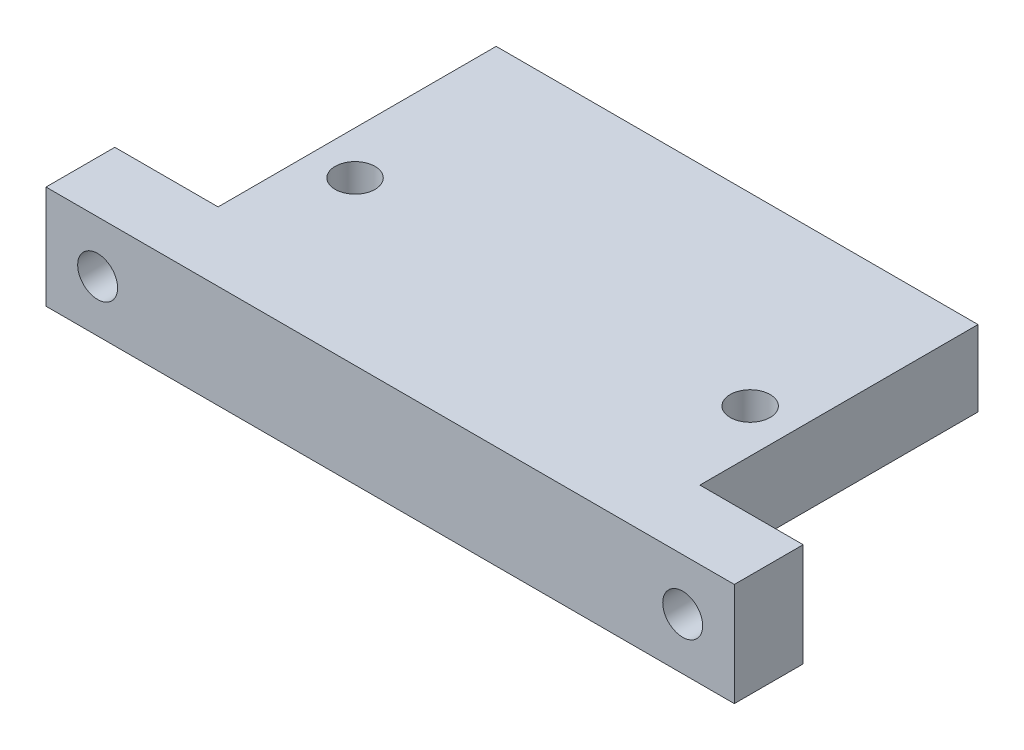
ISO-10303-21;
HEADER;
FILE_DESCRIPTION(('STEP AP214'),'2;1');
FILE_NAME('part.step','',(''),(''),'','','');
FILE_SCHEMA(('AUTOMOTIVE_DESIGN { 1 0 10303 214 1 1 1 1 }'));
ENDSEC;
DATA;
#1=APPLICATION_CONTEXT('core data for automotive mechanical design processes');
#2=APPLICATION_PROTOCOL_DEFINITION('international standard','automotive_design',2000,#1);
#3=PRODUCT_CONTEXT('',#1,'mechanical');
#4=PRODUCT('Part','Part','',(#3));
#5=PRODUCT_RELATED_PRODUCT_CATEGORY('part','',(#4));
#6=PRODUCT_DEFINITION_FORMATION('','',#4);
#7=PRODUCT_DEFINITION_CONTEXT('part definition',#1,'design');
#8=PRODUCT_DEFINITION('design','',#6,#7);
#9=PRODUCT_DEFINITION_SHAPE('','',#8);
#10=(LENGTH_UNIT() NAMED_UNIT(*) SI_UNIT(.MILLI.,.METRE.));
#11=(NAMED_UNIT(*) PLANE_ANGLE_UNIT() SI_UNIT($,.RADIAN.));
#12=(NAMED_UNIT(*) SI_UNIT($,.STERADIAN.) SOLID_ANGLE_UNIT());
#13=UNCERTAINTY_MEASURE_WITH_UNIT(LENGTH_MEASURE(1.E-05),#10,'distance_accuracy_value','');
#14=(GEOMETRIC_REPRESENTATION_CONTEXT(3) GLOBAL_UNCERTAINTY_ASSIGNED_CONTEXT((#13)) GLOBAL_UNIT_ASSIGNED_CONTEXT((#10,
#11,#12)) REPRESENTATION_CONTEXT('',''));
#15=CARTESIAN_POINT('',(0.,0.,0.));
#16=DIRECTION('',(0.,0.,1.));
#17=DIRECTION('',(1.,0.,0.));
#18=AXIS2_PLACEMENT_3D('',#15,#16,#17);
#19=CARTESIAN_POINT('',(-17.5,7.5,5.6));
#20=DIRECTION('',(0.,0.,1.));
#21=DIRECTION('',(1.,0.,0.));
#22=AXIS2_PLACEMENT_3D('',#19,#20,#21);
#23=PLANE('',#22);
#24=CARTESIAN_POINT('',(-21.25,3.75,5.6));
#25=DIRECTION('',(0.,0.,-1.));
#26=DIRECTION('',(-1.,0.,0.));
#27=AXIS2_PLACEMENT_3D('',#24,#25,#26);
#28=CIRCLE('',#27,1.44999999999999);
#29=CARTESIAN_POINT('',(-22.7,3.75,5.6));
#30=VERTEX_POINT('',#29);
#31=EDGE_CURVE('E295',#30,#30,#28,.T.);
#32=ORIENTED_EDGE('',*,*,#31,.F.);
#33=EDGE_LOOP('',(#32));
#34=FACE_BOUND('',#33,.T.);
#35=DIRECTION('',(0.,-1.,0.));
#36=VECTOR('',#35,1.);
#37=CARTESIAN_POINT('',(-17.5,7.5,5.6));
#38=LINE('',#37,#36);
#39=CARTESIAN_POINT('',(-17.5,7.5,5.6));
#40=VERTEX_POINT('',#39);
#41=CARTESIAN_POINT('',(-17.5,2.,5.6));
#42=VERTEX_POINT('',#41);
#43=EDGE_CURVE('E125',#40,#42,#38,.T.);
#44=ORIENTED_EDGE('',*,*,#43,.T.);
#45=DIRECTION('',(1.,0.,0.));
#46=VECTOR('',#45,1.);
#47=CARTESIAN_POINT('',(-25.,2.,5.6));
#48=LINE('',#47,#46);
#49=CARTESIAN_POINT('',(17.5,2.,5.6));
#50=VERTEX_POINT('',#49);
#51=EDGE_CURVE('E318',#42,#50,#48,.T.);
#52=ORIENTED_EDGE('',*,*,#51,.T.);
#53=DIRECTION('',(0.,-1.,0.));
#54=VECTOR('',#53,1.);
#55=CARTESIAN_POINT('',(17.5,7.5,5.6));
#56=LINE('',#55,#54);
#57=CARTESIAN_POINT('',(17.5,7.5,5.6));
#58=VERTEX_POINT('',#57);
#59=EDGE_CURVE('E145',#58,#50,#56,.T.);
#60=ORIENTED_EDGE('',*,*,#59,.F.);
#61=DIRECTION('',(-1.,0.,0.));
#62=VECTOR('',#61,1.);
#63=CARTESIAN_POINT('',(25.,7.5,5.6));
#64=LINE('',#63,#62);
#65=CARTESIAN_POINT('',(25.,7.5,5.6));
#66=VERTEX_POINT('',#65);
#67=EDGE_CURVE('E326',#66,#58,#64,.T.);
#68=ORIENTED_EDGE('',*,*,#67,.F.);
#69=DIRECTION('',(0.,-1.,0.));
#70=VECTOR('',#69,1.);
#71=CARTESIAN_POINT('',(25.,7.5,5.6));
#72=LINE('',#71,#70);
#73=CARTESIAN_POINT('',(25.,0.,5.6));
#74=VERTEX_POINT('',#73);
#75=EDGE_CURVE('E148',#66,#74,#72,.T.);
#76=ORIENTED_EDGE('',*,*,#75,.T.);
#77=DIRECTION('',(-1.,0.,0.));
#78=VECTOR('',#77,1.);
#79=CARTESIAN_POINT('',(-17.5,0.,5.6));
#80=LINE('',#79,#78);
#81=CARTESIAN_POINT('',(-25.,0.,5.6));
#82=VERTEX_POINT('',#81);
#83=EDGE_CURVE('E74',#74,#82,#80,.T.);
#84=ORIENTED_EDGE('',*,*,#83,.T.);
#85=DIRECTION('',(0.,-1.,0.));
#86=VECTOR('',#85,1.);
#87=CARTESIAN_POINT('',(-25.,7.5,5.6));
#88=LINE('',#87,#86);
#89=CARTESIAN_POINT('',(-25.,7.5,5.6));
#90=VERTEX_POINT('',#89);
#91=EDGE_CURVE('E81',#90,#82,#88,.T.);
#92=ORIENTED_EDGE('',*,*,#91,.F.);
#93=DIRECTION('',(-1.,0.,0.));
#94=VECTOR('',#93,1.);
#95=CARTESIAN_POINT('',(-17.5,7.5,5.6));
#96=LINE('',#95,#94);
#97=EDGE_CURVE('E56',#40,#90,#96,.T.);
#98=ORIENTED_EDGE('',*,*,#97,.F.);
#99=EDGE_LOOP('',(#44,#52,#60,#68,#76,#84,#92,#98));
#100=FACE_BOUND('',#99,.T.);
#101=CARTESIAN_POINT('',(21.25,3.75,5.6));
#102=DIRECTION('',(0.,0.,-1.));
#103=DIRECTION('',(-1.,0.,0.));
#104=AXIS2_PLACEMENT_3D('',#101,#102,#103);
#105=CIRCLE('',#104,1.44999999999999);
#106=CARTESIAN_POINT('',(19.8,3.75,5.6));
#107=VERTEX_POINT('',#106);
#108=EDGE_CURVE('E292',#107,#107,#105,.T.);
#109=ORIENTED_EDGE('',*,*,#108,.F.);
#110=EDGE_LOOP('',(#109));
#111=FACE_BOUND('',#110,.T.);
#112=ADVANCED_FACE('F39',(#34,#100,#111),#23,.F.);
#113=CARTESIAN_POINT('',(-25.,7.5,5.6));
#114=DIRECTION('',(1.,0.,0.));
#115=DIRECTION('',(0.,0.,-1.));
#116=AXIS2_PLACEMENT_3D('',#113,#114,#115);
#117=PLANE('',#116);
#118=DIRECTION('',(0.,0.,1.));
#119=VECTOR('',#118,1.);
#120=CARTESIAN_POINT('',(-25.,0.,5.6));
#121=LINE('',#120,#119);
#122=CARTESIAN_POINT('',(-25.,0.,10.6));
#123=VERTEX_POINT('',#122);
#124=EDGE_CURVE('E133',#82,#123,#121,.T.);
#125=ORIENTED_EDGE('',*,*,#124,.T.);
#126=DIRECTION('',(0.,-1.,0.));
#127=VECTOR('',#126,1.);
#128=CARTESIAN_POINT('',(-25.,7.5,10.6));
#129=LINE('',#128,#127);
#130=CARTESIAN_POINT('',(-25.,7.5,10.6));
#131=VERTEX_POINT('',#130);
#132=EDGE_CURVE('E11',#131,#123,#129,.T.);
#133=ORIENTED_EDGE('',*,*,#132,.F.);
#134=DIRECTION('',(0.,0.,1.));
#135=VECTOR('',#134,1.);
#136=CARTESIAN_POINT('',(-25.,7.5,5.6));
#137=LINE('',#136,#135);
#138=EDGE_CURVE('E141',#90,#131,#137,.T.);
#139=ORIENTED_EDGE('',*,*,#138,.F.);
#140=ORIENTED_EDGE('',*,*,#91,.T.);
#141=EDGE_LOOP('',(#125,#133,#139,#140));
#142=FACE_BOUND('',#141,.T.);
#143=ADVANCED_FACE('F41',(#142),#117,.F.);
#144=CARTESIAN_POINT('',(-25.,7.5,10.6));
#145=DIRECTION('',(0.,0.,-1.));
#146=DIRECTION('',(-1.,0.,0.));
#147=AXIS2_PLACEMENT_3D('',#144,#145,#146);
#148=PLANE('',#147);
#149=CARTESIAN_POINT('',(21.25,3.75,10.6));
#150=DIRECTION('',(0.,0.,-1.));
#151=DIRECTION('',(-1.,0.,0.));
#152=AXIS2_PLACEMENT_3D('',#149,#150,#151);
#153=CIRCLE('',#152,1.44999999999999);
#154=CARTESIAN_POINT('',(19.8,3.75,10.6));
#155=VERTEX_POINT('',#154);
#156=EDGE_CURVE('E289',#155,#155,#153,.T.);
#157=ORIENTED_EDGE('',*,*,#156,.T.);
#158=EDGE_LOOP('',(#157));
#159=FACE_BOUND('',#158,.T.);
#160=CARTESIAN_POINT('',(-21.25,3.75,10.6));
#161=DIRECTION('',(0.,0.,-1.));
#162=DIRECTION('',(-1.,0.,0.));
#163=AXIS2_PLACEMENT_3D('',#160,#161,#162);
#164=CIRCLE('',#163,1.44999999999999);
#165=CARTESIAN_POINT('',(-22.7,3.75,10.6));
#166=VERTEX_POINT('',#165);
#167=EDGE_CURVE('E300',#166,#166,#164,.T.);
#168=ORIENTED_EDGE('',*,*,#167,.T.);
#169=EDGE_LOOP('',(#168));
#170=FACE_BOUND('',#169,.T.);
#171=DIRECTION('',(1.,0.,0.));
#172=VECTOR('',#171,1.);
#173=CARTESIAN_POINT('',(-25.,0.,10.6));
#174=LINE('',#173,#172);
#175=CARTESIAN_POINT('',(25.,0.,10.6));
#176=VERTEX_POINT('',#175);
#177=EDGE_CURVE('E135',#123,#176,#174,.T.);
#178=ORIENTED_EDGE('',*,*,#177,.T.);
#179=DIRECTION('',(0.,-1.,0.));
#180=VECTOR('',#179,1.);
#181=CARTESIAN_POINT('',(25.,7.5,10.6));
#182=LINE('',#181,#180);
#183=CARTESIAN_POINT('',(25.,7.5,10.6));
#184=VERTEX_POINT('',#183);
#185=EDGE_CURVE('E48',#184,#176,#182,.T.);
#186=ORIENTED_EDGE('',*,*,#185,.F.);
#187=DIRECTION('',(1.,0.,0.));
#188=VECTOR('',#187,1.);
#189=CARTESIAN_POINT('',(-25.,7.5,10.6));
#190=LINE('',#189,#188);
#191=EDGE_CURVE('E88',#131,#184,#190,.T.);
#192=ORIENTED_EDGE('',*,*,#191,.F.);
#193=ORIENTED_EDGE('',*,*,#132,.T.);
#194=EDGE_LOOP('',(#178,#186,#192,#193));
#195=FACE_BOUND('',#194,.T.);
#196=ADVANCED_FACE('F158',(#159,#170,#195),#148,.F.);
#197=CARTESIAN_POINT('',(25.,7.5,10.6));
#198=DIRECTION('',(-1.,0.,0.));
#199=DIRECTION('',(0.,0.,1.));
#200=AXIS2_PLACEMENT_3D('',#197,#198,#199);
#201=PLANE('',#200);
#202=DIRECTION('',(0.,0.,-1.));
#203=VECTOR('',#202,1.);
#204=CARTESIAN_POINT('',(25.,0.,10.6));
#205=LINE('',#204,#203);
#206=EDGE_CURVE('E138',#176,#74,#205,.T.);
#207=ORIENTED_EDGE('',*,*,#206,.T.);
#208=ORIENTED_EDGE('',*,*,#75,.F.);
#209=DIRECTION('',(0.,0.,-1.));
#210=VECTOR('',#209,1.);
#211=CARTESIAN_POINT('',(25.,7.5,10.6));
#212=LINE('',#211,#210);
#213=EDGE_CURVE('E155',#184,#66,#212,.T.);
#214=ORIENTED_EDGE('',*,*,#213,.F.);
#215=ORIENTED_EDGE('',*,*,#185,.T.);
#216=EDGE_LOOP('',(#207,#208,#214,#215));
#217=FACE_BOUND('',#216,.T.);
#218=ADVANCED_FACE('F153',(#217),#201,.F.);
#219=CARTESIAN_POINT('',(17.5,7.5,5.6));
#220=DIRECTION('',(-1.,0.,0.));
#221=DIRECTION('',(0.,0.,1.));
#222=AXIS2_PLACEMENT_3D('',#219,#220,#221);
#223=PLANE('',#222);
#224=ORIENTED_EDGE('',*,*,#59,.T.);
#225=DIRECTION('',(0.,0.,1.));
#226=VECTOR('',#225,1.);
#227=CARTESIAN_POINT('',(17.5,2.,5.6));
#228=LINE('',#227,#226);
#229=CARTESIAN_POINT('',(17.5,2.,-14.6));
#230=VERTEX_POINT('',#229);
#231=EDGE_CURVE('E315',#230,#50,#228,.T.);
#232=ORIENTED_EDGE('',*,*,#231,.F.);
#233=DIRECTION('',(0.,-1.,0.));
#234=VECTOR('',#233,1.);
#235=CARTESIAN_POINT('',(17.5,7.5,-14.6));
#236=LINE('',#235,#234);
#237=CARTESIAN_POINT('',(17.5,7.5,-14.6));
#238=VERTEX_POINT('',#237);
#239=EDGE_CURVE('E124',#238,#230,#236,.T.);
#240=ORIENTED_EDGE('',*,*,#239,.F.);
#241=DIRECTION('',(0.,0.,-1.));
#242=VECTOR('',#241,1.);
#243=CARTESIAN_POINT('',(17.5,7.5,5.6));
#244=LINE('',#243,#242);
#245=EDGE_CURVE('E110',#58,#238,#244,.T.);
#246=ORIENTED_EDGE('',*,*,#245,.F.);
#247=EDGE_LOOP('',(#224,#232,#240,#246));
#248=FACE_BOUND('',#247,.T.);
#249=ADVANCED_FACE('F181',(#248),#223,.F.);
#250=CARTESIAN_POINT('',(17.5,7.5,-14.6));
#251=DIRECTION('',(0.,0.,1.));
#252=DIRECTION('',(1.,0.,0.));
#253=AXIS2_PLACEMENT_3D('',#250,#251,#252);
#254=PLANE('',#253);
#255=ORIENTED_EDGE('',*,*,#239,.T.);
#256=DIRECTION('',(1.,0.,0.));
#257=VECTOR('',#256,1.);
#258=CARTESIAN_POINT('',(-25.,2.,-14.6));
#259=LINE('',#258,#257);
#260=CARTESIAN_POINT('',(-17.5,2.,-14.6));
#261=VERTEX_POINT('',#260);
#262=EDGE_CURVE('E121',#261,#230,#259,.T.);
#263=ORIENTED_EDGE('',*,*,#262,.F.);
#264=DIRECTION('',(0.,-1.,0.));
#265=VECTOR('',#264,1.);
#266=CARTESIAN_POINT('',(-17.5,7.5,-14.6));
#267=LINE('',#266,#265);
#268=CARTESIAN_POINT('',(-17.5,7.5,-14.6));
#269=VERTEX_POINT('',#268);
#270=EDGE_CURVE('E117',#269,#261,#267,.T.);
#271=ORIENTED_EDGE('',*,*,#270,.F.);
#272=DIRECTION('',(-1.,0.,0.));
#273=VECTOR('',#272,1.);
#274=CARTESIAN_POINT('',(17.5,7.5,-14.6));
#275=LINE('',#274,#273);
#276=EDGE_CURVE('E103',#238,#269,#275,.T.);
#277=ORIENTED_EDGE('',*,*,#276,.F.);
#278=EDGE_LOOP('',(#255,#263,#271,#277));
#279=FACE_BOUND('',#278,.T.);
#280=ADVANCED_FACE('F118',(#279),#254,.F.);
#281=CARTESIAN_POINT('',(-17.5,7.5,-14.6));
#282=DIRECTION('',(1.,0.,0.));
#283=DIRECTION('',(0.,0.,-1.));
#284=AXIS2_PLACEMENT_3D('',#281,#282,#283);
#285=PLANE('',#284);
#286=ORIENTED_EDGE('',*,*,#270,.T.);
#287=DIRECTION('',(0.,0.,1.));
#288=VECTOR('',#287,1.);
#289=CARTESIAN_POINT('',(-17.5,2.,-14.6));
#290=LINE('',#289,#288);
#291=EDGE_CURVE('E136',#261,#42,#290,.T.);
#292=ORIENTED_EDGE('',*,*,#291,.T.);
#293=ORIENTED_EDGE('',*,*,#43,.F.);
#294=DIRECTION('',(0.,0.,1.));
#295=VECTOR('',#294,1.);
#296=CARTESIAN_POINT('',(-17.5,7.5,-14.6));
#297=LINE('',#296,#295);
#298=EDGE_CURVE('E107',#269,#40,#297,.T.);
#299=ORIENTED_EDGE('',*,*,#298,.F.);
#300=EDGE_LOOP('',(#286,#292,#293,#299));
#301=FACE_BOUND('',#300,.T.);
#302=ADVANCED_FACE('F127',(#301),#285,.F.);
#303=CARTESIAN_POINT('',(0.,7.5,0.));
#304=DIRECTION('',(0.,1.,0.));
#305=DIRECTION('',(0.,0.,1.));
#306=AXIS2_PLACEMENT_3D('',#303,#304,#305);
#307=PLANE('',#306);
#308=CARTESIAN_POINT('',(-14.35,7.5,-1.2));
#309=DIRECTION('',(0.,1.,0.));
#310=DIRECTION('',(0.,0.,1.));
#311=AXIS2_PLACEMENT_3D('',#308,#309,#310);
#312=CIRCLE('',#311,1.44999999999999);
#313=CARTESIAN_POINT('',(-14.35,7.5,0.249999999999985));
#314=VERTEX_POINT('',#313);
#315=EDGE_CURVE('E303',#314,#314,#312,.T.);
#316=ORIENTED_EDGE('',*,*,#315,.F.);
#317=EDGE_LOOP('',(#316));
#318=FACE_BOUND('',#317,.T.);
#319=CARTESIAN_POINT('',(14.35,7.5,-1.2));
#320=DIRECTION('',(0.,1.,0.));
#321=DIRECTION('',(0.,0.,1.));
#322=AXIS2_PLACEMENT_3D('',#319,#320,#321);
#323=CIRCLE('',#322,1.44999999999999);
#324=CARTESIAN_POINT('',(14.35,7.5,0.249999999999985));
#325=VERTEX_POINT('',#324);
#326=EDGE_CURVE('E309',#325,#325,#323,.T.);
#327=ORIENTED_EDGE('',*,*,#326,.F.);
#328=EDGE_LOOP('',(#327));
#329=FACE_BOUND('',#328,.T.);
#330=ORIENTED_EDGE('',*,*,#138,.T.);
#331=ORIENTED_EDGE('',*,*,#191,.T.);
#332=ORIENTED_EDGE('',*,*,#213,.T.);
#333=ORIENTED_EDGE('',*,*,#67,.T.);
#334=ORIENTED_EDGE('',*,*,#245,.T.);
#335=ORIENTED_EDGE('',*,*,#276,.T.);
#336=ORIENTED_EDGE('',*,*,#298,.T.);
#337=ORIENTED_EDGE('',*,*,#97,.T.);
#338=EDGE_LOOP('',(#330,#331,#332,#333,#334,#335,#336,#337));
#339=FACE_BOUND('',#338,.T.);
#340=ADVANCED_FACE('F105',(#318,#329,#339),#307,.T.);
#341=CARTESIAN_POINT('',(0.,0.,0.));
#342=DIRECTION('',(0.,1.,0.));
#343=DIRECTION('',(0.,0.,1.));
#344=AXIS2_PLACEMENT_3D('',#341,#342,#343);
#345=PLANE('',#344);
#346=ORIENTED_EDGE('',*,*,#83,.F.);
#347=ORIENTED_EDGE('',*,*,#206,.F.);
#348=ORIENTED_EDGE('',*,*,#177,.F.);
#349=ORIENTED_EDGE('',*,*,#124,.F.);
#350=EDGE_LOOP('',(#346,#347,#348,#349));
#351=FACE_BOUND('',#350,.T.);
#352=ADVANCED_FACE('F156',(#351),#345,.F.);
#353=CARTESIAN_POINT('',(-25.,2.,5.6));
#354=DIRECTION('',(0.,1.,0.));
#355=DIRECTION('',(0.,0.,1.));
#356=AXIS2_PLACEMENT_3D('',#353,#354,#355);
#357=PLANE('',#356);
#358=CARTESIAN_POINT('',(-14.35,2.,-1.2));
#359=DIRECTION('',(0.,1.,0.));
#360=DIRECTION('',(0.,0.,1.));
#361=AXIS2_PLACEMENT_3D('',#358,#359,#360);
#362=CIRCLE('',#361,1.44999999999999);
#363=CARTESIAN_POINT('',(-14.35,2.,0.24999999999999));
#364=VERTEX_POINT('',#363);
#365=EDGE_CURVE('E306',#364,#364,#362,.T.);
#366=ORIENTED_EDGE('',*,*,#365,.T.);
#367=EDGE_LOOP('',(#366));
#368=FACE_BOUND('',#367,.T.);
#369=CARTESIAN_POINT('',(14.35,2.,-1.2));
#370=DIRECTION('',(0.,1.,0.));
#371=DIRECTION('',(0.,0.,1.));
#372=AXIS2_PLACEMENT_3D('',#369,#370,#371);
#373=CIRCLE('',#372,1.44999999999999);
#374=CARTESIAN_POINT('',(14.35,2.,0.24999999999999));
#375=VERTEX_POINT('',#374);
#376=EDGE_CURVE('E312',#375,#375,#373,.T.);
#377=ORIENTED_EDGE('',*,*,#376,.T.);
#378=EDGE_LOOP('',(#377));
#379=FACE_BOUND('',#378,.T.);
#380=ORIENTED_EDGE('',*,*,#262,.T.);
#381=ORIENTED_EDGE('',*,*,#231,.T.);
#382=ORIENTED_EDGE('',*,*,#51,.F.);
#383=ORIENTED_EDGE('',*,*,#291,.F.);
#384=EDGE_LOOP('',(#380,#381,#382,#383));
#385=FACE_BOUND('',#384,.T.);
#386=ADVANCED_FACE('F227',(#368,#379,#385),#357,.F.);
#387=CARTESIAN_POINT('',(14.35,7.5,-1.2));
#388=DIRECTION('',(0.,1.,0.));
#389=DIRECTION('',(0.,0.,1.));
#390=AXIS2_PLACEMENT_3D('',#387,#388,#389);
#391=CYLINDRICAL_SURFACE('',#390,1.44999999999999);
#392=ORIENTED_EDGE('',*,*,#376,.F.);
#393=EDGE_LOOP('',(#392));
#394=FACE_BOUND('',#393,.T.);
#395=ORIENTED_EDGE('',*,*,#326,.T.);
#396=EDGE_LOOP('',(#395));
#397=FACE_BOUND('',#396,.T.);
#398=ADVANCED_FACE('F234',(#394,#397),#391,.F.);
#399=CARTESIAN_POINT('',(-14.35,7.5,-1.2));
#400=DIRECTION('',(0.,1.,0.));
#401=DIRECTION('',(0.,0.,1.));
#402=AXIS2_PLACEMENT_3D('',#399,#400,#401);
#403=CYLINDRICAL_SURFACE('',#402,1.44999999999999);
#404=ORIENTED_EDGE('',*,*,#365,.F.);
#405=EDGE_LOOP('',(#404));
#406=FACE_BOUND('',#405,.T.);
#407=ORIENTED_EDGE('',*,*,#315,.T.);
#408=EDGE_LOOP('',(#407));
#409=FACE_BOUND('',#408,.T.);
#410=ADVANCED_FACE('F244',(#406,#409),#403,.F.);
#411=CARTESIAN_POINT('',(-21.25,3.75,5.6));
#412=DIRECTION('',(0.,0.,-1.));
#413=DIRECTION('',(-1.,0.,0.));
#414=AXIS2_PLACEMENT_3D('',#411,#412,#413);
#415=CYLINDRICAL_SURFACE('',#414,1.44999999999999);
#416=ORIENTED_EDGE('',*,*,#167,.F.);
#417=EDGE_LOOP('',(#416));
#418=FACE_BOUND('',#417,.T.);
#419=ORIENTED_EDGE('',*,*,#31,.T.);
#420=EDGE_LOOP('',(#419));
#421=FACE_BOUND('',#420,.T.);
#422=ADVANCED_FACE('F253',(#418,#421),#415,.F.);
#423=CARTESIAN_POINT('',(21.25,3.75,5.6));
#424=DIRECTION('',(0.,0.,-1.));
#425=DIRECTION('',(-1.,0.,0.));
#426=AXIS2_PLACEMENT_3D('',#423,#424,#425);
#427=CYLINDRICAL_SURFACE('',#426,1.44999999999999);
#428=ORIENTED_EDGE('',*,*,#156,.F.);
#429=EDGE_LOOP('',(#428));
#430=FACE_BOUND('',#429,.T.);
#431=ORIENTED_EDGE('',*,*,#108,.T.);
#432=EDGE_LOOP('',(#431));
#433=FACE_BOUND('',#432,.T.);
#434=ADVANCED_FACE('F273',(#430,#433),#427,.F.);
#435=CLOSED_SHELL('',(#112,#143,#196,#218,#249,#280,#302,#340,#352,#386,#398,#410,#422,#434));
#436=MANIFOLD_SOLID_BREP('B2',#435);
#437=ADVANCED_BREP_SHAPE_REPRESENTATION('',(#18,#436),#14);
#438=SHAPE_DEFINITION_REPRESENTATION(#9,#437);
ENDSEC;
END-ISO-10303-21;
